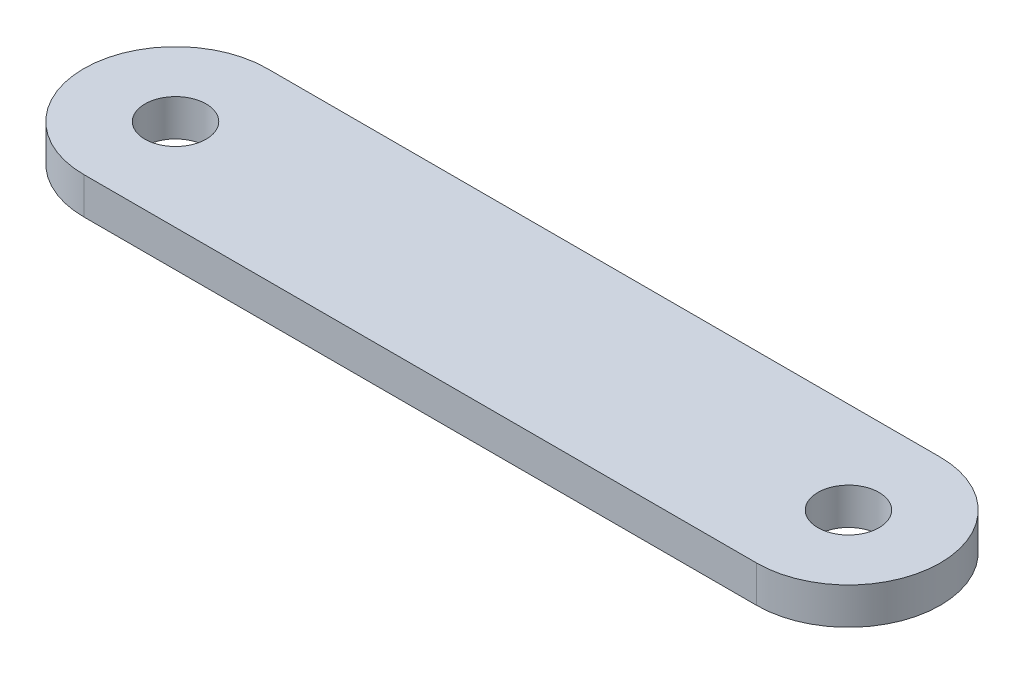
ISO-10303-21;
HEADER;
FILE_DESCRIPTION(('STEP AP214'),'2;1');
FILE_NAME('part.step','',(''),(''),'','','');
FILE_SCHEMA(('AUTOMOTIVE_DESIGN { 1 0 10303 214 1 1 1 1 }'));
ENDSEC;
DATA;
#1=APPLICATION_CONTEXT('core data for automotive mechanical design processes');
#2=APPLICATION_PROTOCOL_DEFINITION('international standard','automotive_design',2000,#1);
#3=PRODUCT_CONTEXT('',#1,'mechanical');
#4=PRODUCT('Part','Part','',(#3));
#5=PRODUCT_RELATED_PRODUCT_CATEGORY('part','',(#4));
#6=PRODUCT_DEFINITION_FORMATION('','',#4);
#7=PRODUCT_DEFINITION_CONTEXT('part definition',#1,'design');
#8=PRODUCT_DEFINITION('design','',#6,#7);
#9=PRODUCT_DEFINITION_SHAPE('','',#8);
#10=(LENGTH_UNIT() NAMED_UNIT(*) SI_UNIT(.MILLI.,.METRE.));
#11=(NAMED_UNIT(*) PLANE_ANGLE_UNIT() SI_UNIT($,.RADIAN.));
#12=(NAMED_UNIT(*) SI_UNIT($,.STERADIAN.) SOLID_ANGLE_UNIT());
#13=UNCERTAINTY_MEASURE_WITH_UNIT(LENGTH_MEASURE(1.E-05),#10,'distance_accuracy_value','');
#14=(GEOMETRIC_REPRESENTATION_CONTEXT(3) GLOBAL_UNCERTAINTY_ASSIGNED_CONTEXT((#13)) GLOBAL_UNIT_ASSIGNED_CONTEXT((#10,
#11,#12)) REPRESENTATION_CONTEXT('',''));
#15=CARTESIAN_POINT('',(0.,0.,0.));
#16=DIRECTION('',(0.,0.,1.));
#17=DIRECTION('',(1.,0.,0.));
#18=AXIS2_PLACEMENT_3D('',#15,#16,#17);
#19=CARTESIAN_POINT('',(65.,6.,0.));
#20=DIRECTION('',(0.,1.,0.));
#21=DIRECTION('',(0.,0.,1.));
#22=AXIS2_PLACEMENT_3D('',#19,#20,#21);
#23=PLANE('',#22);
#24=CARTESIAN_POINT('',(-45.,6.,0.));
#25=DIRECTION('',(0.,1.,0.));
#26=DIRECTION('',(0.,0.,1.));
#27=AXIS2_PLACEMENT_3D('',#24,#25,#26);
#28=CIRCLE('',#27,5.);
#29=CARTESIAN_POINT('',(-45.,6.,5.));
#30=VERTEX_POINT('',#29);
#31=EDGE_CURVE('E104',#30,#30,#28,.T.);
#32=ORIENTED_EDGE('',*,*,#31,.F.);
#33=EDGE_LOOP('',(#32));
#34=FACE_BOUND('',#33,.T.);
#35=CARTESIAN_POINT('',(65.,6.,0.));
#36=DIRECTION('',(0.,1.,0.));
#37=DIRECTION('',(0.,0.,1.));
#38=AXIS2_PLACEMENT_3D('',#35,#36,#37);
#39=CIRCLE('',#38,15.);
#40=CARTESIAN_POINT('',(65.,6.,15.));
#41=VERTEX_POINT('',#40);
#42=CARTESIAN_POINT('',(65.,6.,-15.));
#43=VERTEX_POINT('',#42);
#44=EDGE_CURVE('E89',#41,#43,#39,.T.);
#45=ORIENTED_EDGE('',*,*,#44,.T.);
#46=DIRECTION('',(-1.,0.,0.));
#47=VECTOR('',#46,1.);
#48=CARTESIAN_POINT('',(-45.,6.,-15.));
#49=LINE('',#48,#47);
#50=CARTESIAN_POINT('',(-45.,6.,-15.));
#51=VERTEX_POINT('',#50);
#52=EDGE_CURVE('E84',#43,#51,#49,.T.);
#53=ORIENTED_EDGE('',*,*,#52,.T.);
#54=CARTESIAN_POINT('',(-45.,6.,0.));
#55=DIRECTION('',(0.,1.,0.));
#56=DIRECTION('',(0.,0.,1.));
#57=AXIS2_PLACEMENT_3D('',#54,#55,#56);
#58=CIRCLE('',#57,15.);
#59=CARTESIAN_POINT('',(-45.,6.,15.));
#60=VERTEX_POINT('',#59);
#61=EDGE_CURVE('E87',#51,#60,#58,.T.);
#62=ORIENTED_EDGE('',*,*,#61,.T.);
#63=DIRECTION('',(1.,0.,0.));
#64=VECTOR('',#63,1.);
#65=CARTESIAN_POINT('',(-45.,6.,15.));
#66=LINE('',#65,#64);
#67=EDGE_CURVE('E54',#60,#41,#66,.T.);
#68=ORIENTED_EDGE('',*,*,#67,.T.);
#69=EDGE_LOOP('',(#45,#53,#62,#68));
#70=FACE_BOUND('',#69,.T.);
#71=CARTESIAN_POINT('',(65.,6.,0.));
#72=DIRECTION('',(0.,1.,0.));
#73=DIRECTION('',(0.,0.,1.));
#74=AXIS2_PLACEMENT_3D('',#71,#72,#73);
#75=CIRCLE('',#74,5.);
#76=CARTESIAN_POINT('',(65.,6.,5.));
#77=VERTEX_POINT('',#76);
#78=EDGE_CURVE('E119',#77,#77,#75,.T.);
#79=ORIENTED_EDGE('',*,*,#78,.F.);
#80=EDGE_LOOP('',(#79));
#81=FACE_BOUND('',#80,.T.);
#82=ADVANCED_FACE('F37',(#34,#70,#81),#23,.T.);
#83=CARTESIAN_POINT('',(65.,0.,0.));
#84=DIRECTION('',(0.,1.,0.));
#85=DIRECTION('',(0.,0.,1.));
#86=AXIS2_PLACEMENT_3D('',#83,#84,#85);
#87=PLANE('',#86);
#88=CARTESIAN_POINT('',(65.,0.,0.));
#89=DIRECTION('',(0.,1.,0.));
#90=DIRECTION('',(0.,0.,1.));
#91=AXIS2_PLACEMENT_3D('',#88,#89,#90);
#92=CIRCLE('',#91,15.);
#93=CARTESIAN_POINT('',(65.,0.,15.));
#94=VERTEX_POINT('',#93);
#95=CARTESIAN_POINT('',(65.,0.,-15.));
#96=VERTEX_POINT('',#95);
#97=EDGE_CURVE('E101',#94,#96,#92,.T.);
#98=ORIENTED_EDGE('',*,*,#97,.F.);
#99=DIRECTION('',(1.,0.,0.));
#100=VECTOR('',#99,1.);
#101=CARTESIAN_POINT('',(-45.,0.,15.));
#102=LINE('',#101,#100);
#103=CARTESIAN_POINT('',(-45.,0.,15.));
#104=VERTEX_POINT('',#103);
#105=EDGE_CURVE('E77',#104,#94,#102,.T.);
#106=ORIENTED_EDGE('',*,*,#105,.F.);
#107=CARTESIAN_POINT('',(-45.,0.,0.));
#108=DIRECTION('',(0.,1.,0.));
#109=DIRECTION('',(0.,0.,1.));
#110=AXIS2_PLACEMENT_3D('',#107,#108,#109);
#111=CIRCLE('',#110,15.);
#112=CARTESIAN_POINT('',(-45.,0.,-15.));
#113=VERTEX_POINT('',#112);
#114=EDGE_CURVE('E71',#113,#104,#111,.T.);
#115=ORIENTED_EDGE('',*,*,#114,.F.);
#116=DIRECTION('',(-1.,0.,0.));
#117=VECTOR('',#116,1.);
#118=CARTESIAN_POINT('',(-45.,0.,-15.));
#119=LINE('',#118,#117);
#120=EDGE_CURVE('E93',#96,#113,#119,.T.);
#121=ORIENTED_EDGE('',*,*,#120,.F.);
#122=EDGE_LOOP('',(#98,#106,#115,#121));
#123=FACE_BOUND('',#122,.T.);
#124=CARTESIAN_POINT('',(-45.,0.,0.));
#125=DIRECTION('',(0.,1.,0.));
#126=DIRECTION('',(0.,0.,1.));
#127=AXIS2_PLACEMENT_3D('',#124,#125,#126);
#128=CIRCLE('',#127,5.);
#129=CARTESIAN_POINT('',(-45.,0.,5.));
#130=VERTEX_POINT('',#129);
#131=EDGE_CURVE('E116',#130,#130,#128,.T.);
#132=ORIENTED_EDGE('',*,*,#131,.T.);
#133=EDGE_LOOP('',(#132));
#134=FACE_BOUND('',#133,.T.);
#135=CARTESIAN_POINT('',(65.,0.,0.));
#136=DIRECTION('',(0.,1.,0.));
#137=DIRECTION('',(0.,0.,1.));
#138=AXIS2_PLACEMENT_3D('',#135,#136,#137);
#139=CIRCLE('',#138,5.);
#140=CARTESIAN_POINT('',(65.,0.,5.));
#141=VERTEX_POINT('',#140);
#142=EDGE_CURVE('E122',#141,#141,#139,.T.);
#143=ORIENTED_EDGE('',*,*,#142,.T.);
#144=EDGE_LOOP('',(#143));
#145=FACE_BOUND('',#144,.T.);
#146=ADVANCED_FACE('F112',(#123,#134,#145),#87,.F.);
#147=CARTESIAN_POINT('',(65.,6.,0.));
#148=DIRECTION('',(0.,-1.,0.));
#149=DIRECTION('',(0.,0.,-1.));
#150=AXIS2_PLACEMENT_3D('',#147,#148,#149);
#151=CYLINDRICAL_SURFACE('',#150,15.);
#152=ORIENTED_EDGE('',*,*,#97,.T.);
#153=DIRECTION('',(0.,-1.,0.));
#154=VECTOR('',#153,1.);
#155=CARTESIAN_POINT('',(65.,6.,-15.));
#156=LINE('',#155,#154);
#157=EDGE_CURVE('E11',#43,#96,#156,.T.);
#158=ORIENTED_EDGE('',*,*,#157,.F.);
#159=ORIENTED_EDGE('',*,*,#44,.F.);
#160=DIRECTION('',(0.,-1.,0.));
#161=VECTOR('',#160,1.);
#162=CARTESIAN_POINT('',(65.,6.,15.));
#163=LINE('',#162,#161);
#164=EDGE_CURVE('E97',#41,#94,#163,.T.);
#165=ORIENTED_EDGE('',*,*,#164,.T.);
#166=EDGE_LOOP('',(#152,#158,#159,#165));
#167=FACE_BOUND('',#166,.T.);
#168=ADVANCED_FACE('F39',(#167),#151,.T.);
#169=CARTESIAN_POINT('',(-45.,6.,-15.));
#170=DIRECTION('',(0.,0.,1.));
#171=DIRECTION('',(1.,0.,0.));
#172=AXIS2_PLACEMENT_3D('',#169,#170,#171);
#173=PLANE('',#172);
#174=ORIENTED_EDGE('',*,*,#120,.T.);
#175=DIRECTION('',(0.,-1.,0.));
#176=VECTOR('',#175,1.);
#177=CARTESIAN_POINT('',(-45.,6.,-15.));
#178=LINE('',#177,#176);
#179=EDGE_CURVE('E46',#51,#113,#178,.T.);
#180=ORIENTED_EDGE('',*,*,#179,.F.);
#181=ORIENTED_EDGE('',*,*,#52,.F.);
#182=ORIENTED_EDGE('',*,*,#157,.T.);
#183=EDGE_LOOP('',(#174,#180,#181,#182));
#184=FACE_BOUND('',#183,.T.);
#185=ADVANCED_FACE('F92',(#184),#173,.F.);
#186=CARTESIAN_POINT('',(-45.,6.,0.));
#187=DIRECTION('',(0.,-1.,0.));
#188=DIRECTION('',(0.,0.,-1.));
#189=AXIS2_PLACEMENT_3D('',#186,#187,#188);
#190=CYLINDRICAL_SURFACE('',#189,15.);
#191=ORIENTED_EDGE('',*,*,#114,.T.);
#192=DIRECTION('',(0.,-1.,0.));
#193=VECTOR('',#192,1.);
#194=CARTESIAN_POINT('',(-45.,6.,15.));
#195=LINE('',#194,#193);
#196=EDGE_CURVE('E94',#60,#104,#195,.T.);
#197=ORIENTED_EDGE('',*,*,#196,.F.);
#198=ORIENTED_EDGE('',*,*,#61,.F.);
#199=ORIENTED_EDGE('',*,*,#179,.T.);
#200=EDGE_LOOP('',(#191,#197,#198,#199));
#201=FACE_BOUND('',#200,.T.);
#202=ADVANCED_FACE('F95',(#201),#190,.T.);
#203=CARTESIAN_POINT('',(-45.,6.,15.));
#204=DIRECTION('',(0.,0.,-1.));
#205=DIRECTION('',(-1.,0.,0.));
#206=AXIS2_PLACEMENT_3D('',#203,#204,#205);
#207=PLANE('',#206);
#208=ORIENTED_EDGE('',*,*,#105,.T.);
#209=ORIENTED_EDGE('',*,*,#164,.F.);
#210=ORIENTED_EDGE('',*,*,#67,.F.);
#211=ORIENTED_EDGE('',*,*,#196,.T.);
#212=EDGE_LOOP('',(#208,#209,#210,#211));
#213=FACE_BOUND('',#212,.T.);
#214=ADVANCED_FACE('F109',(#213),#207,.F.);
#215=CARTESIAN_POINT('',(-45.,6.,0.));
#216=DIRECTION('',(0.,-1.,0.));
#217=DIRECTION('',(0.,0.,-1.));
#218=AXIS2_PLACEMENT_3D('',#215,#216,#217);
#219=CYLINDRICAL_SURFACE('',#218,5.);
#220=ORIENTED_EDGE('',*,*,#31,.T.);
#221=EDGE_LOOP('',(#220));
#222=FACE_BOUND('',#221,.T.);
#223=ORIENTED_EDGE('',*,*,#131,.F.);
#224=EDGE_LOOP('',(#223));
#225=FACE_BOUND('',#224,.T.);
#226=ADVANCED_FACE('F139',(#222,#225),#219,.F.);
#227=CARTESIAN_POINT('',(65.,6.,0.));
#228=DIRECTION('',(0.,-1.,0.));
#229=DIRECTION('',(0.,0.,-1.));
#230=AXIS2_PLACEMENT_3D('',#227,#228,#229);
#231=CYLINDRICAL_SURFACE('',#230,5.);
#232=ORIENTED_EDGE('',*,*,#78,.T.);
#233=EDGE_LOOP('',(#232));
#234=FACE_BOUND('',#233,.T.);
#235=ORIENTED_EDGE('',*,*,#142,.F.);
#236=EDGE_LOOP('',(#235));
#237=FACE_BOUND('',#236,.T.);
#238=ADVANCED_FACE('F128',(#234,#237),#231,.F.);
#239=CLOSED_SHELL('',(#82,#146,#168,#185,#202,#214,#226,#238));
#240=MANIFOLD_SOLID_BREP('B2',#239);
#241=ADVANCED_BREP_SHAPE_REPRESENTATION('',(#18,#240),#14);
#242=SHAPE_DEFINITION_REPRESENTATION(#9,#241);
ENDSEC;
END-ISO-10303-21;
